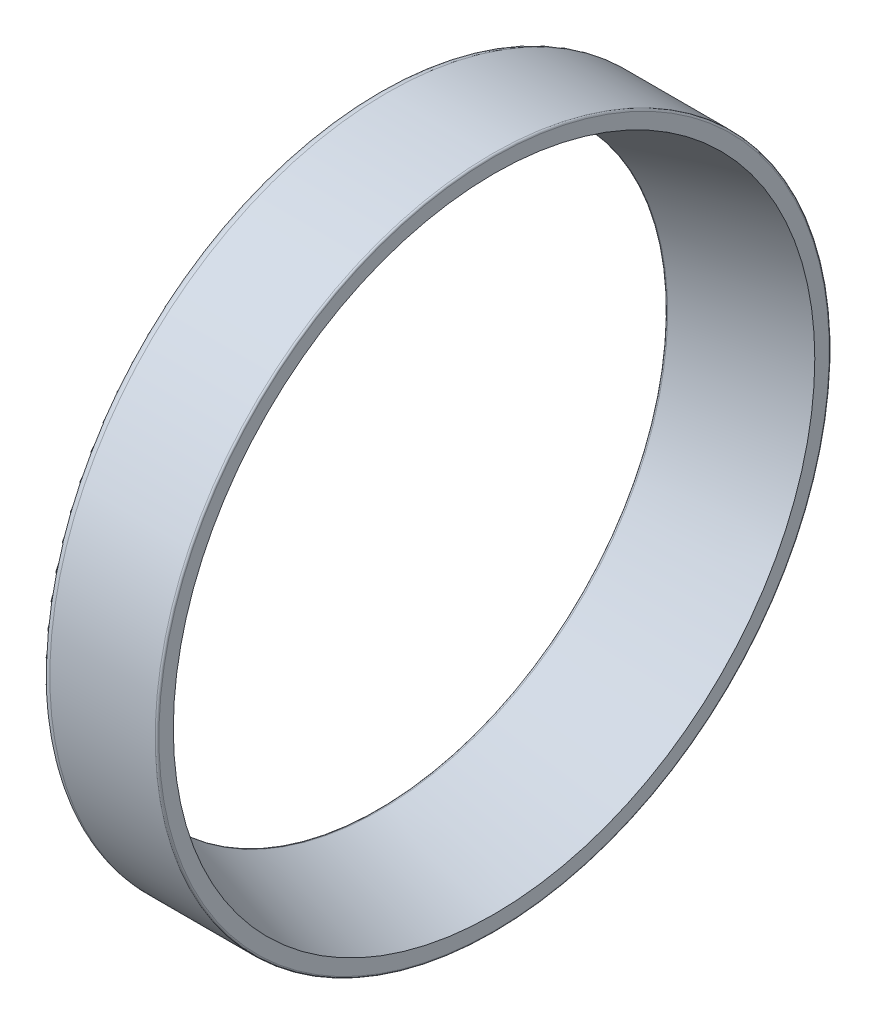
ISO-10303-21;
HEADER;
FILE_DESCRIPTION(('STEP AP214'),'2;1');
FILE_NAME('part.step','',(''),(''),'','','');
FILE_SCHEMA(('AUTOMOTIVE_DESIGN { 1 0 10303 214 1 1 1 1 }'));
ENDSEC;
DATA;
#1=APPLICATION_CONTEXT('core data for automotive mechanical design processes');
#2=APPLICATION_PROTOCOL_DEFINITION('international standard','automotive_design',2000,#1);
#3=PRODUCT_CONTEXT('',#1,'mechanical');
#4=PRODUCT('Part','Part','',(#3));
#5=PRODUCT_RELATED_PRODUCT_CATEGORY('part','',(#4));
#6=PRODUCT_DEFINITION_FORMATION('','',#4);
#7=PRODUCT_DEFINITION_CONTEXT('part definition',#1,'design');
#8=PRODUCT_DEFINITION('design','',#6,#7);
#9=PRODUCT_DEFINITION_SHAPE('','',#8);
#10=(LENGTH_UNIT() NAMED_UNIT(*) SI_UNIT(.MILLI.,.METRE.));
#11=(NAMED_UNIT(*) PLANE_ANGLE_UNIT() SI_UNIT($,.RADIAN.));
#12=(NAMED_UNIT(*) SI_UNIT($,.STERADIAN.) SOLID_ANGLE_UNIT());
#13=UNCERTAINTY_MEASURE_WITH_UNIT(LENGTH_MEASURE(1.E-05),#10,'distance_accuracy_value','');
#14=(GEOMETRIC_REPRESENTATION_CONTEXT(3) GLOBAL_UNCERTAINTY_ASSIGNED_CONTEXT((#13)) GLOBAL_UNIT_ASSIGNED_CONTEXT((#10,
#11,#12)) REPRESENTATION_CONTEXT('',''));
#15=CARTESIAN_POINT('',(0.,0.,0.));
#16=DIRECTION('',(0.,0.,1.));
#17=DIRECTION('',(1.,0.,0.));
#18=AXIS2_PLACEMENT_3D('',#15,#16,#17);
#19=CARTESIAN_POINT('',(0.3,0.,0.));
#20=DIRECTION('',(1.,0.,0.));
#21=DIRECTION('',(0.,0.,-1.));
#22=AXIS2_PLACEMENT_3D('',#19,#20,#21);
#23=TOROIDAL_SURFACE('',#22,47.2386868937321,0.3);
#24=CARTESIAN_POINT('',(0.383531391101202,0.,0.));
#25=DIRECTION('',(1.,0.,0.));
#26=DIRECTION('',(0.,1.,0.));
#27=AXIS2_PLACEMENT_3D('',#24,#25,#26);
#28=CIRCLE('',#27,46.9505506296127);
#29=CARTESIAN_POINT('',(0.383531391101202,46.9505506296127,0.));
#30=VERTEX_POINT('',#29);
#31=EDGE_CURVE('E11',#30,#30,#28,.T.);
#32=ORIENTED_EDGE('',*,*,#31,.T.);
#33=EDGE_LOOP('',(#32));
#34=FACE_BOUND('',#33,.T.);
#35=CARTESIAN_POINT('',(0.,0.,0.));
#36=DIRECTION('',(1.,0.,0.));
#37=DIRECTION('',(0.,1.,0.));
#38=AXIS2_PLACEMENT_3D('',#35,#36,#37);
#39=CIRCLE('',#38,47.2386868937321);
#40=CARTESIAN_POINT('',(0.,47.2386868937321,0.));
#41=VERTEX_POINT('',#40);
#42=EDGE_CURVE('E55',#41,#41,#39,.T.);
#43=ORIENTED_EDGE('',*,*,#42,.F.);
#44=EDGE_LOOP('',(#43));
#45=FACE_BOUND('',#44,.T.);
#46=ADVANCED_FACE('F17',(#34,#45),#23,.T.);
#47=CARTESIAN_POINT('',(9.6917656955506,0.,0.));
#48=DIRECTION('',(1.,0.,0.));
#49=DIRECTION('',(0.,1.,0.));
#50=AXIS2_PLACEMENT_3D('',#47,#48,#49);
#51=CONICAL_SURFACE('',#50,49.6490299845901,0.282167380169924);
#52=CARTESIAN_POINT('',(19.,0.,0.));
#53=DIRECTION('',(1.,0.,0.));
#54=DIRECTION('',(0.,1.,0.));
#55=AXIS2_PLACEMENT_3D('',#52,#53,#54);
#56=CIRCLE('',#55,52.3475093395676);
#57=CARTESIAN_POINT('',(19.,52.3475093395676,0.));
#58=VERTEX_POINT('',#57);
#59=EDGE_CURVE('E24',#58,#58,#56,.T.);
#60=ORIENTED_EDGE('',*,*,#59,.T.);
#61=EDGE_LOOP('',(#60));
#62=FACE_BOUND('',#61,.T.);
#63=ORIENTED_EDGE('',*,*,#31,.F.);
#64=EDGE_LOOP('',(#63));
#65=FACE_BOUND('',#64,.T.);
#66=ADVANCED_FACE('F78',(#62,#65),#51,.F.);
#67=CARTESIAN_POINT('',(19.,53.5237546697838,0.));
#68=DIRECTION('',(1.,0.,0.));
#69=DIRECTION('',(0.,1.,0.));
#70=AXIS2_PLACEMENT_3D('',#67,#68,#69);
#71=PLANE('',#70);
#72=CARTESIAN_POINT('',(19.,0.,0.));
#73=DIRECTION('',(1.,0.,0.));
#74=DIRECTION('',(0.,1.,0.));
#75=AXIS2_PLACEMENT_3D('',#72,#73,#74);
#76=CIRCLE('',#75,54.7);
#77=CARTESIAN_POINT('',(19.,54.7,0.));
#78=VERTEX_POINT('',#77);
#79=EDGE_CURVE('E52',#78,#78,#76,.T.);
#80=ORIENTED_EDGE('',*,*,#79,.T.);
#81=EDGE_LOOP('',(#80));
#82=FACE_BOUND('',#81,.T.);
#83=ORIENTED_EDGE('',*,*,#59,.F.);
#84=EDGE_LOOP('',(#83));
#85=FACE_BOUND('',#84,.T.);
#86=ADVANCED_FACE('F82',(#82,#85),#71,.T.);
#87=CARTESIAN_POINT('',(18.7,0.,0.));
#88=DIRECTION('',(1.,0.,0.));
#89=DIRECTION('',(0.,0.,-1.));
#90=AXIS2_PLACEMENT_3D('',#87,#88,#89);
#91=TOROIDAL_SURFACE('',#90,54.7,0.3);
#92=CARTESIAN_POINT('',(18.7,0.,0.));
#93=DIRECTION('',(1.,0.,0.));
#94=DIRECTION('',(0.,1.,0.));
#95=AXIS2_PLACEMENT_3D('',#92,#93,#94);
#96=CIRCLE('',#95,55.);
#97=CARTESIAN_POINT('',(18.7,55.,0.));
#98=VERTEX_POINT('',#97);
#99=EDGE_CURVE('E48',#98,#98,#96,.T.);
#100=ORIENTED_EDGE('',*,*,#99,.T.);
#101=EDGE_LOOP('',(#100));
#102=FACE_BOUND('',#101,.T.);
#103=ORIENTED_EDGE('',*,*,#79,.F.);
#104=EDGE_LOOP('',(#103));
#105=FACE_BOUND('',#104,.T.);
#106=ADVANCED_FACE('F49',(#102,#105),#91,.T.);
#107=CARTESIAN_POINT('',(10.1,0.,0.));
#108=DIRECTION('',(-1.,0.,0.));
#109=DIRECTION('',(0.,1.,0.));
#110=AXIS2_PLACEMENT_3D('',#107,#108,#109);
#111=CYLINDRICAL_SURFACE('',#110,55.);
#112=CARTESIAN_POINT('',(1.5,0.,0.));
#113=DIRECTION('',(1.,0.,0.));
#114=DIRECTION('',(0.,1.,0.));
#115=AXIS2_PLACEMENT_3D('',#112,#113,#114);
#116=CIRCLE('',#115,55.);
#117=CARTESIAN_POINT('',(1.5,55.,0.));
#118=VERTEX_POINT('',#117);
#119=EDGE_CURVE('E53',#118,#118,#116,.T.);
#120=ORIENTED_EDGE('',*,*,#119,.T.);
#121=EDGE_LOOP('',(#120));
#122=FACE_BOUND('',#121,.T.);
#123=ORIENTED_EDGE('',*,*,#99,.F.);
#124=EDGE_LOOP('',(#123));
#125=FACE_BOUND('',#124,.T.);
#126=ADVANCED_FACE('F74',(#122,#125),#111,.T.);
#127=CARTESIAN_POINT('',(1.5,0.,0.));
#128=DIRECTION('',(1.,0.,0.));
#129=DIRECTION('',(0.,0.,-1.));
#130=AXIS2_PLACEMENT_3D('',#127,#128,#129);
#131=TOROIDAL_SURFACE('',#130,53.5,1.5);
#132=CARTESIAN_POINT('',(0.,0.,0.));
#133=DIRECTION('',(1.,0.,0.));
#134=DIRECTION('',(0.,1.,0.));
#135=AXIS2_PLACEMENT_3D('',#132,#133,#134);
#136=CIRCLE('',#135,53.5);
#137=CARTESIAN_POINT('',(0.,53.5,0.));
#138=VERTEX_POINT('',#137);
#139=EDGE_CURVE('E59',#138,#138,#136,.T.);
#140=ORIENTED_EDGE('',*,*,#139,.T.);
#141=EDGE_LOOP('',(#140));
#142=FACE_BOUND('',#141,.T.);
#143=ORIENTED_EDGE('',*,*,#119,.F.);
#144=EDGE_LOOP('',(#143));
#145=FACE_BOUND('',#144,.T.);
#146=ADVANCED_FACE('F63',(#142,#145),#131,.T.);
#147=CARTESIAN_POINT('',(0.,50.3693434468661,0.));
#148=DIRECTION('',(-1.,0.,0.));
#149=DIRECTION('',(0.,-1.,0.));
#150=AXIS2_PLACEMENT_3D('',#147,#148,#149);
#151=PLANE('',#150);
#152=ORIENTED_EDGE('',*,*,#42,.T.);
#153=EDGE_LOOP('',(#152));
#154=FACE_BOUND('',#153,.T.);
#155=ORIENTED_EDGE('',*,*,#139,.F.);
#156=EDGE_LOOP('',(#155));
#157=FACE_BOUND('',#156,.T.);
#158=ADVANCED_FACE('F66',(#154,#157),#151,.T.);
#159=CLOSED_SHELL('',(#46,#66,#86,#106,#126,#146,#158));
#160=MANIFOLD_SOLID_BREP('B1',#159);
#161=ADVANCED_BREP_SHAPE_REPRESENTATION('',(#18,#160),#14);
#162=SHAPE_DEFINITION_REPRESENTATION(#9,#161);
ENDSEC;
END-ISO-10303-21;
